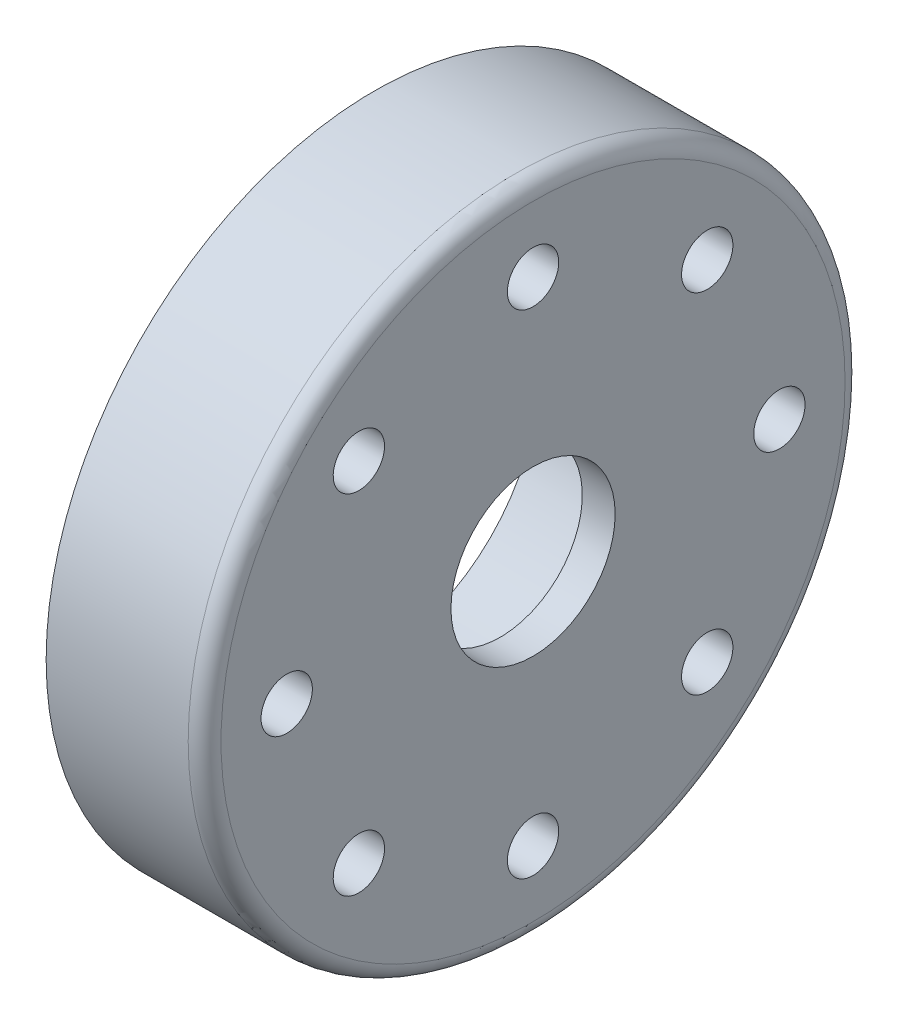
ISO-10303-21;
HEADER;
FILE_DESCRIPTION(('STEP AP214'),'2;1');
FILE_NAME('part.step','',(''),(''),'','','');
FILE_SCHEMA(('AUTOMOTIVE_DESIGN { 1 0 10303 214 1 1 1 1 }'));
ENDSEC;
DATA;
#1=APPLICATION_CONTEXT('core data for automotive mechanical design processes');
#2=APPLICATION_PROTOCOL_DEFINITION('international standard','automotive_design',2000,#1);
#3=PRODUCT_CONTEXT('',#1,'mechanical');
#4=PRODUCT('Part','Part','',(#3));
#5=PRODUCT_RELATED_PRODUCT_CATEGORY('part','',(#4));
#6=PRODUCT_DEFINITION_FORMATION('','',#4);
#7=PRODUCT_DEFINITION_CONTEXT('part definition',#1,'design');
#8=PRODUCT_DEFINITION('design','',#6,#7);
#9=PRODUCT_DEFINITION_SHAPE('','',#8);
#10=(LENGTH_UNIT() NAMED_UNIT(*) SI_UNIT(.MILLI.,.METRE.));
#11=(NAMED_UNIT(*) PLANE_ANGLE_UNIT() SI_UNIT($,.RADIAN.));
#12=(NAMED_UNIT(*) SI_UNIT($,.STERADIAN.) SOLID_ANGLE_UNIT());
#13=UNCERTAINTY_MEASURE_WITH_UNIT(LENGTH_MEASURE(1.E-05),#10,'distance_accuracy_value','');
#14=(GEOMETRIC_REPRESENTATION_CONTEXT(3) GLOBAL_UNCERTAINTY_ASSIGNED_CONTEXT((#13)) GLOBAL_UNIT_ASSIGNED_CONTEXT((#10,
#11,#12)) REPRESENTATION_CONTEXT('',''));
#15=CARTESIAN_POINT('',(0.,0.,0.));
#16=DIRECTION('',(0.,0.,1.));
#17=DIRECTION('',(1.,0.,0.));
#18=AXIS2_PLACEMENT_3D('',#15,#16,#17);
#19=CARTESIAN_POINT('',(24.511,0.,0.));
#20=DIRECTION('',(-1.,0.,0.));
#21=DIRECTION('',(0.,0.,1.));
#22=AXIS2_PLACEMENT_3D('',#19,#20,#21);
#23=CYLINDRICAL_SURFACE('',#22,50.8);
#24=CARTESIAN_POINT('',(21.971,0.,0.));
#25=DIRECTION('',(1.,0.,0.));
#26=DIRECTION('',(0.,0.,-1.));
#27=AXIS2_PLACEMENT_3D('',#24,#25,#26);
#28=CIRCLE('',#27,50.8);
#29=CARTESIAN_POINT('',(21.971,0.,-50.8));
#30=VERTEX_POINT('',#29);
#31=EDGE_CURVE('E11',#30,#30,#28,.F.);
#32=ORIENTED_EDGE('',*,*,#31,.T.);
#33=EDGE_LOOP('',(#32));
#34=FACE_BOUND('',#33,.T.);
#35=CARTESIAN_POINT('',(0.,0.,0.));
#36=DIRECTION('',(1.,0.,0.));
#37=DIRECTION('',(0.,0.,-1.));
#38=AXIS2_PLACEMENT_3D('',#35,#36,#37);
#39=CIRCLE('',#38,50.8);
#40=CARTESIAN_POINT('',(0.,0.,-50.8));
#41=VERTEX_POINT('',#40);
#42=EDGE_CURVE('E45',#41,#41,#39,.T.);
#43=ORIENTED_EDGE('',*,*,#42,.T.);
#44=EDGE_LOOP('',(#43));
#45=FACE_BOUND('',#44,.T.);
#46=ADVANCED_FACE('F34',(#34,#45),#23,.T.);
#47=CARTESIAN_POINT('',(24.511,0.,0.));
#48=DIRECTION('',(1.,0.,0.));
#49=DIRECTION('',(0.,0.,-1.));
#50=AXIS2_PLACEMENT_3D('',#47,#48,#49);
#51=PLANE('',#50);
#52=CARTESIAN_POINT('',(24.511,0.,0.));
#53=DIRECTION('',(1.,0.,0.));
#54=DIRECTION('',(0.,0.,-1.));
#55=AXIS2_PLACEMENT_3D('',#52,#53,#54);
#56=CIRCLE('',#55,12.7);
#57=CARTESIAN_POINT('',(24.511,0.,-12.7));
#58=VERTEX_POINT('',#57);
#59=EDGE_CURVE('E105',#58,#58,#56,.F.);
#60=ORIENTED_EDGE('',*,*,#59,.T.);
#61=EDGE_LOOP('',(#60));
#62=FACE_BOUND('',#61,.T.);
#63=CARTESIAN_POINT('',(24.511,-38.1,1.33025439009923E-13));
#64=DIRECTION('',(1.,0.,0.));
#65=DIRECTION('',(0.,-1.,0.));
#66=AXIS2_PLACEMENT_3D('',#63,#64,#65);
#67=CIRCLE('',#66,3.96875);
#68=CARTESIAN_POINT('',(24.511,-42.06875,1.46882255573457E-13));
#69=VERTEX_POINT('',#68);
#70=EDGE_CURVE('E63',#69,#69,#67,.T.);
#71=ORIENTED_EDGE('',*,*,#70,.F.);
#72=EDGE_LOOP('',(#71));
#73=FACE_BOUND('',#72,.T.);
#74=CARTESIAN_POINT('',(24.511,-26.9407683632073,26.9407683632076));
#75=DIRECTION('',(1.,0.,0.));
#76=DIRECTION('',(0.,-0.707106781186544,0.707106781186551));
#77=AXIS2_PLACEMENT_3D('',#74,#75,#76);
#78=CIRCLE('',#77,3.96875);
#79=CARTESIAN_POINT('',(24.511,-29.7470984010414,29.7470984010417));
#80=VERTEX_POINT('',#79);
#81=EDGE_CURVE('E78',#80,#80,#78,.T.);
#82=ORIENTED_EDGE('',*,*,#81,.F.);
#83=EDGE_LOOP('',(#82));
#84=FACE_BOUND('',#83,.T.);
#85=CARTESIAN_POINT('',(24.511,0.,38.1));
#86=DIRECTION('',(1.,0.,0.));
#87=DIRECTION('',(0.,0.,1.));
#88=AXIS2_PLACEMENT_3D('',#85,#86,#87);
#89=CIRCLE('',#88,3.96875);
#90=CARTESIAN_POINT('',(24.511,0.,42.06875));
#91=VERTEX_POINT('',#90);
#92=EDGE_CURVE('E72',#91,#91,#89,.T.);
#93=ORIENTED_EDGE('',*,*,#92,.F.);
#94=EDGE_LOOP('',(#93));
#95=FACE_BOUND('',#94,.T.);
#96=CARTESIAN_POINT('',(24.511,26.9407683632077,26.9407683632072));
#97=DIRECTION('',(1.,0.,0.));
#98=DIRECTION('',(0.,0.707106781186554,0.707106781186541));
#99=AXIS2_PLACEMENT_3D('',#96,#97,#98);
#100=CIRCLE('',#99,3.96875);
#101=CARTESIAN_POINT('',(24.511,29.7470984010418,29.7470984010413));
#102=VERTEX_POINT('',#101);
#103=EDGE_CURVE('E64',#102,#102,#100,.T.);
#104=ORIENTED_EDGE('',*,*,#103,.F.);
#105=EDGE_LOOP('',(#104));
#106=FACE_BOUND('',#105,.T.);
#107=CARTESIAN_POINT('',(24.511,38.1,-3.9907631702977E-13));
#108=DIRECTION('',(1.,0.,0.));
#109=DIRECTION('',(0.,1.,0.));
#110=AXIS2_PLACEMENT_3D('',#107,#108,#109);
#111=CIRCLE('',#110,3.96875);
#112=CARTESIAN_POINT('',(24.511,42.06875,-4.40646766720371E-13));
#113=VERTEX_POINT('',#112);
#114=EDGE_CURVE('E71',#113,#113,#111,.T.);
#115=ORIENTED_EDGE('',*,*,#114,.F.);
#116=EDGE_LOOP('',(#115));
#117=FACE_BOUND('',#116,.T.);
#118=CARTESIAN_POINT('',(24.511,26.9407683632071,-26.9407683632078));
#119=DIRECTION('',(1.,0.,0.));
#120=DIRECTION('',(0.,0.707106781186539,-0.707106781186556));
#121=AXIS2_PLACEMENT_3D('',#118,#119,#120);
#122=CIRCLE('',#121,3.96875);
#123=CARTESIAN_POINT('',(24.511,29.7470984010412,-29.7470984010419));
#124=VERTEX_POINT('',#123);
#125=EDGE_CURVE('E88',#124,#124,#122,.T.);
#126=ORIENTED_EDGE('',*,*,#125,.F.);
#127=EDGE_LOOP('',(#126));
#128=FACE_BOUND('',#127,.T.);
#129=CARTESIAN_POINT('',(24.511,-26.9407683632075,-26.9407683632074));
#130=DIRECTION('',(1.,0.,0.));
#131=DIRECTION('',(0.,-0.707106781186549,-0.707106781186546));
#132=AXIS2_PLACEMENT_3D('',#129,#130,#131);
#133=CIRCLE('',#132,3.96875);
#134=CARTESIAN_POINT('',(24.511,-29.7470984010416,-29.7470984010415));
#135=VERTEX_POINT('',#134);
#136=EDGE_CURVE('E57',#135,#135,#133,.T.);
#137=ORIENTED_EDGE('',*,*,#136,.F.);
#138=EDGE_LOOP('',(#137));
#139=FACE_BOUND('',#138,.T.);
#140=CARTESIAN_POINT('',(24.511,0.,-38.1));
#141=DIRECTION('',(1.,0.,0.));
#142=DIRECTION('',(0.,0.,-1.));
#143=AXIS2_PLACEMENT_3D('',#140,#141,#142);
#144=CIRCLE('',#143,3.96875);
#145=CARTESIAN_POINT('',(24.511,0.,-42.06875));
#146=VERTEX_POINT('',#145);
#147=EDGE_CURVE('E54',#146,#146,#144,.T.);
#148=ORIENTED_EDGE('',*,*,#147,.F.);
#149=EDGE_LOOP('',(#148));
#150=FACE_BOUND('',#149,.T.);
#151=CARTESIAN_POINT('',(24.511,0.,0.));
#152=DIRECTION('',(1.,0.,0.));
#153=DIRECTION('',(0.,0.,-1.));
#154=AXIS2_PLACEMENT_3D('',#151,#152,#153);
#155=CIRCLE('',#154,48.26);
#156=CARTESIAN_POINT('',(24.511,0.,-48.26));
#157=VERTEX_POINT('',#156);
#158=EDGE_CURVE('E41',#157,#157,#155,.T.);
#159=ORIENTED_EDGE('',*,*,#158,.T.);
#160=EDGE_LOOP('',(#159));
#161=FACE_BOUND('',#160,.T.);
#162=ADVANCED_FACE('F131',(#62,#73,#84,#95,#106,#117,#128,#139,#150,#161),#51,.T.);
#163=CARTESIAN_POINT('',(0.,0.,0.));
#164=DIRECTION('',(1.,0.,0.));
#165=DIRECTION('',(0.,0.,-1.));
#166=AXIS2_PLACEMENT_3D('',#163,#164,#165);
#167=PLANE('',#166);
#168=CARTESIAN_POINT('',(0.,0.,0.));
#169=DIRECTION('',(-1.,0.,0.));
#170=DIRECTION('',(0.,0.,1.));
#171=AXIS2_PLACEMENT_3D('',#168,#169,#170);
#172=CIRCLE('',#171,25.4);
#173=CARTESIAN_POINT('',(0.,0.,25.4));
#174=VERTEX_POINT('',#173);
#175=EDGE_CURVE('E102',#174,#174,#172,.T.);
#176=ORIENTED_EDGE('',*,*,#175,.F.);
#177=EDGE_LOOP('',(#176));
#178=FACE_BOUND('',#177,.T.);
#179=CARTESIAN_POINT('',(0.,-38.1,1.33025439009923E-13));
#180=DIRECTION('',(1.,0.,0.));
#181=DIRECTION('',(0.,-1.,0.));
#182=AXIS2_PLACEMENT_3D('',#179,#180,#181);
#183=CIRCLE('',#182,3.96875);
#184=CARTESIAN_POINT('',(0.,-42.06875,1.46882255573457E-13));
#185=VERTEX_POINT('',#184);
#186=EDGE_CURVE('E81',#185,#185,#183,.F.);
#187=ORIENTED_EDGE('',*,*,#186,.F.);
#188=EDGE_LOOP('',(#187));
#189=FACE_BOUND('',#188,.T.);
#190=CARTESIAN_POINT('',(0.,-26.9407683632073,26.9407683632076));
#191=DIRECTION('',(1.,0.,0.));
#192=DIRECTION('',(0.,-0.707106781186544,0.707106781186551));
#193=AXIS2_PLACEMENT_3D('',#190,#191,#192);
#194=CIRCLE('',#193,3.96875);
#195=CARTESIAN_POINT('',(0.,-29.7470984010414,29.7470984010417));
#196=VERTEX_POINT('',#195);
#197=EDGE_CURVE('E75',#196,#196,#194,.F.);
#198=ORIENTED_EDGE('',*,*,#197,.F.);
#199=EDGE_LOOP('',(#198));
#200=FACE_BOUND('',#199,.T.);
#201=CARTESIAN_POINT('',(0.,0.,38.1));
#202=DIRECTION('',(1.,0.,0.));
#203=DIRECTION('',(0.,0.,1.));
#204=AXIS2_PLACEMENT_3D('',#201,#202,#203);
#205=CIRCLE('',#204,3.96875);
#206=CARTESIAN_POINT('',(0.,0.,42.06875));
#207=VERTEX_POINT('',#206);
#208=EDGE_CURVE('E67',#207,#207,#205,.F.);
#209=ORIENTED_EDGE('',*,*,#208,.F.);
#210=EDGE_LOOP('',(#209));
#211=FACE_BOUND('',#210,.T.);
#212=CARTESIAN_POINT('',(0.,26.9407683632077,26.9407683632072));
#213=DIRECTION('',(1.,0.,0.));
#214=DIRECTION('',(0.,0.707106781186554,0.707106781186541));
#215=AXIS2_PLACEMENT_3D('',#212,#213,#214);
#216=CIRCLE('',#215,3.96875);
#217=CARTESIAN_POINT('',(0.,29.7470984010418,29.7470984010413));
#218=VERTEX_POINT('',#217);
#219=EDGE_CURVE('E68',#218,#218,#216,.F.);
#220=ORIENTED_EDGE('',*,*,#219,.F.);
#221=EDGE_LOOP('',(#220));
#222=FACE_BOUND('',#221,.T.);
#223=CARTESIAN_POINT('',(0.,38.1,-3.9907631702977E-13));
#224=DIRECTION('',(1.,0.,0.));
#225=DIRECTION('',(0.,1.,0.));
#226=AXIS2_PLACEMENT_3D('',#223,#224,#225);
#227=CIRCLE('',#226,3.96875);
#228=CARTESIAN_POINT('',(0.,42.06875,-4.40646766720371E-13));
#229=VERTEX_POINT('',#228);
#230=EDGE_CURVE('E91',#229,#229,#227,.F.);
#231=ORIENTED_EDGE('',*,*,#230,.F.);
#232=EDGE_LOOP('',(#231));
#233=FACE_BOUND('',#232,.T.);
#234=CARTESIAN_POINT('',(0.,26.9407683632071,-26.9407683632078));
#235=DIRECTION('',(1.,0.,0.));
#236=DIRECTION('',(0.,0.707106781186539,-0.707106781186556));
#237=AXIS2_PLACEMENT_3D('',#234,#235,#236);
#238=CIRCLE('',#237,3.96875);
#239=CARTESIAN_POINT('',(0.,29.7470984010412,-29.7470984010419));
#240=VERTEX_POINT('',#239);
#241=EDGE_CURVE('E92',#240,#240,#238,.F.);
#242=ORIENTED_EDGE('',*,*,#241,.F.);
#243=EDGE_LOOP('',(#242));
#244=FACE_BOUND('',#243,.T.);
#245=CARTESIAN_POINT('',(0.,-26.9407683632075,-26.9407683632074));
#246=DIRECTION('',(1.,0.,0.));
#247=DIRECTION('',(0.,-0.707106781186549,-0.707106781186546));
#248=AXIS2_PLACEMENT_3D('',#245,#246,#247);
#249=CIRCLE('',#248,3.96875);
#250=CARTESIAN_POINT('',(0.,-29.7470984010416,-29.7470984010415));
#251=VERTEX_POINT('',#250);
#252=EDGE_CURVE('E60',#251,#251,#249,.F.);
#253=ORIENTED_EDGE('',*,*,#252,.F.);
#254=EDGE_LOOP('',(#253));
#255=FACE_BOUND('',#254,.T.);
#256=CARTESIAN_POINT('',(0.,0.,-38.1));
#257=DIRECTION('',(1.,0.,0.));
#258=DIRECTION('',(0.,0.,-1.));
#259=AXIS2_PLACEMENT_3D('',#256,#257,#258);
#260=CIRCLE('',#259,3.96875);
#261=CARTESIAN_POINT('',(0.,0.,-42.06875));
#262=VERTEX_POINT('',#261);
#263=EDGE_CURVE('E49',#262,#262,#260,.F.);
#264=ORIENTED_EDGE('',*,*,#263,.F.);
#265=EDGE_LOOP('',(#264));
#266=FACE_BOUND('',#265,.T.);
#267=ORIENTED_EDGE('',*,*,#42,.F.);
#268=EDGE_LOOP('',(#267));
#269=FACE_BOUND('',#268,.T.);
#270=ADVANCED_FACE('F135',(#178,#189,#200,#211,#222,#233,#244,#255,#266,#269),#167,.F.);
#271=CARTESIAN_POINT('',(21.971,0.,0.));
#272=DIRECTION('',(1.,0.,0.));
#273=DIRECTION('',(0.,0.,-1.));
#274=AXIS2_PLACEMENT_3D('',#271,#272,#273);
#275=TOROIDAL_SURFACE('',#274,48.26,2.54);
#276=ORIENTED_EDGE('',*,*,#31,.F.);
#277=EDGE_LOOP('',(#276));
#278=FACE_BOUND('',#277,.T.);
#279=ORIENTED_EDGE('',*,*,#158,.F.);
#280=EDGE_LOOP('',(#279));
#281=FACE_BOUND('',#280,.T.);
#282=ADVANCED_FACE('F36',(#278,#281),#275,.T.);
#283=CARTESIAN_POINT('',(-11.2253201513364,0.,-38.1));
#284=DIRECTION('',(1.,0.,0.));
#285=DIRECTION('',(0.,0.,-1.));
#286=AXIS2_PLACEMENT_3D('',#283,#284,#285);
#287=CYLINDRICAL_SURFACE('',#286,3.96875);
#288=ORIENTED_EDGE('',*,*,#263,.T.);
#289=EDGE_LOOP('',(#288));
#290=FACE_BOUND('',#289,.T.);
#291=ORIENTED_EDGE('',*,*,#147,.T.);
#292=EDGE_LOOP('',(#291));
#293=FACE_BOUND('',#292,.T.);
#294=ADVANCED_FACE('F143',(#290,#293),#287,.F.);
#295=CARTESIAN_POINT('',(-11.2253201513364,-26.9407683632075,-26.9407683632074));
#296=DIRECTION('',(1.,0.,0.));
#297=DIRECTION('',(0.,-0.707106781186549,-0.707106781186546));
#298=AXIS2_PLACEMENT_3D('',#295,#296,#297);
#299=CYLINDRICAL_SURFACE('',#298,3.96875);
#300=ORIENTED_EDGE('',*,*,#252,.T.);
#301=EDGE_LOOP('',(#300));
#302=FACE_BOUND('',#301,.T.);
#303=ORIENTED_EDGE('',*,*,#136,.T.);
#304=EDGE_LOOP('',(#303));
#305=FACE_BOUND('',#304,.T.);
#306=ADVANCED_FACE('F146',(#302,#305),#299,.F.);
#307=CARTESIAN_POINT('',(-11.2253201513364,26.9407683632071,-26.9407683632078));
#308=DIRECTION('',(1.,0.,0.));
#309=DIRECTION('',(0.,0.707106781186539,-0.707106781186556));
#310=AXIS2_PLACEMENT_3D('',#307,#308,#309);
#311=CYLINDRICAL_SURFACE('',#310,3.96875);
#312=ORIENTED_EDGE('',*,*,#241,.T.);
#313=EDGE_LOOP('',(#312));
#314=FACE_BOUND('',#313,.T.);
#315=ORIENTED_EDGE('',*,*,#125,.T.);
#316=EDGE_LOOP('',(#315));
#317=FACE_BOUND('',#316,.T.);
#318=ADVANCED_FACE('F150',(#314,#317),#311,.F.);
#319=CARTESIAN_POINT('',(-11.2253201513364,38.1,-3.9907631702977E-13));
#320=DIRECTION('',(1.,0.,0.));
#321=DIRECTION('',(0.,1.,0.));
#322=AXIS2_PLACEMENT_3D('',#319,#320,#321);
#323=CYLINDRICAL_SURFACE('',#322,3.96875);
#324=ORIENTED_EDGE('',*,*,#230,.T.);
#325=EDGE_LOOP('',(#324));
#326=FACE_BOUND('',#325,.T.);
#327=ORIENTED_EDGE('',*,*,#114,.T.);
#328=EDGE_LOOP('',(#327));
#329=FACE_BOUND('',#328,.T.);
#330=ADVANCED_FACE('F156',(#326,#329),#323,.F.);
#331=CARTESIAN_POINT('',(-11.2253201513364,26.9407683632077,26.9407683632072));
#332=DIRECTION('',(1.,0.,0.));
#333=DIRECTION('',(0.,0.707106781186554,0.707106781186541));
#334=AXIS2_PLACEMENT_3D('',#331,#332,#333);
#335=CYLINDRICAL_SURFACE('',#334,3.96875);
#336=ORIENTED_EDGE('',*,*,#219,.T.);
#337=EDGE_LOOP('',(#336));
#338=FACE_BOUND('',#337,.T.);
#339=ORIENTED_EDGE('',*,*,#103,.T.);
#340=EDGE_LOOP('',(#339));
#341=FACE_BOUND('',#340,.T.);
#342=ADVANCED_FACE('F152',(#338,#341),#335,.F.);
#343=CARTESIAN_POINT('',(-11.2253201513364,0.,38.1));
#344=DIRECTION('',(1.,0.,0.));
#345=DIRECTION('',(0.,0.,1.));
#346=AXIS2_PLACEMENT_3D('',#343,#344,#345);
#347=CYLINDRICAL_SURFACE('',#346,3.96875);
#348=ORIENTED_EDGE('',*,*,#208,.T.);
#349=EDGE_LOOP('',(#348));
#350=FACE_BOUND('',#349,.T.);
#351=ORIENTED_EDGE('',*,*,#92,.T.);
#352=EDGE_LOOP('',(#351));
#353=FACE_BOUND('',#352,.T.);
#354=ADVANCED_FACE('F155',(#350,#353),#347,.F.);
#355=CARTESIAN_POINT('',(-11.2253201513364,-26.9407683632073,26.9407683632076));
#356=DIRECTION('',(1.,0.,0.));
#357=DIRECTION('',(0.,-0.707106781186544,0.707106781186551));
#358=AXIS2_PLACEMENT_3D('',#355,#356,#357);
#359=CYLINDRICAL_SURFACE('',#358,3.96875);
#360=ORIENTED_EDGE('',*,*,#197,.T.);
#361=EDGE_LOOP('',(#360));
#362=FACE_BOUND('',#361,.T.);
#363=ORIENTED_EDGE('',*,*,#81,.T.);
#364=EDGE_LOOP('',(#363));
#365=FACE_BOUND('',#364,.T.);
#366=ADVANCED_FACE('F160',(#362,#365),#359,.F.);
#367=CARTESIAN_POINT('',(-11.2253201513364,-38.1,1.33025439009923E-13));
#368=DIRECTION('',(1.,0.,0.));
#369=DIRECTION('',(0.,-1.,0.));
#370=AXIS2_PLACEMENT_3D('',#367,#368,#369);
#371=CYLINDRICAL_SURFACE('',#370,3.96875);
#372=ORIENTED_EDGE('',*,*,#186,.T.);
#373=EDGE_LOOP('',(#372));
#374=FACE_BOUND('',#373,.T.);
#375=ORIENTED_EDGE('',*,*,#70,.T.);
#376=EDGE_LOOP('',(#375));
#377=FACE_BOUND('',#376,.T.);
#378=ADVANCED_FACE('F119',(#374,#377),#371,.F.);
#379=CARTESIAN_POINT('',(19.431,0.,0.));
#380=DIRECTION('',(1.,0.,0.));
#381=DIRECTION('',(0.,0.,-1.));
#382=AXIS2_PLACEMENT_3D('',#379,#380,#381);
#383=PLANE('',#382);
#384=CARTESIAN_POINT('',(19.431,0.,0.));
#385=DIRECTION('',(-1.,0.,0.));
#386=DIRECTION('',(0.,0.,1.));
#387=AXIS2_PLACEMENT_3D('',#384,#385,#386);
#388=CIRCLE('',#387,12.7);
#389=CARTESIAN_POINT('',(19.431,0.,12.7));
#390=VERTEX_POINT('',#389);
#391=EDGE_CURVE('E108',#390,#390,#388,.T.);
#392=ORIENTED_EDGE('',*,*,#391,.F.);
#393=EDGE_LOOP('',(#392));
#394=FACE_BOUND('',#393,.T.);
#395=CARTESIAN_POINT('',(19.431,0.,0.));
#396=DIRECTION('',(1.,0.,0.));
#397=DIRECTION('',(0.,0.,-1.));
#398=AXIS2_PLACEMENT_3D('',#395,#396,#397);
#399=CIRCLE('',#398,25.4);
#400=CARTESIAN_POINT('',(19.431,0.,-25.4));
#401=VERTEX_POINT('',#400);
#402=EDGE_CURVE('E95',#401,#401,#399,.F.);
#403=ORIENTED_EDGE('',*,*,#402,.T.);
#404=EDGE_LOOP('',(#403));
#405=FACE_BOUND('',#404,.T.);
#406=ADVANCED_FACE('F115',(#394,#405),#383,.F.);
#407=CARTESIAN_POINT('',(96.3530489685532,0.,0.));
#408=DIRECTION('',(-1.,0.,0.));
#409=DIRECTION('',(0.,0.,1.));
#410=AXIS2_PLACEMENT_3D('',#407,#408,#409);
#411=CYLINDRICAL_SURFACE('',#410,25.4);
#412=ORIENTED_EDGE('',*,*,#175,.T.);
#413=EDGE_LOOP('',(#412));
#414=FACE_BOUND('',#413,.T.);
#415=ORIENTED_EDGE('',*,*,#402,.F.);
#416=EDGE_LOOP('',(#415));
#417=FACE_BOUND('',#416,.T.);
#418=ADVANCED_FACE('F118',(#414,#417),#411,.F.);
#419=CARTESIAN_POINT('',(60.4320244842766,0.,0.));
#420=DIRECTION('',(-1.,0.,0.));
#421=DIRECTION('',(0.,0.,1.));
#422=AXIS2_PLACEMENT_3D('',#419,#420,#421);
#423=CYLINDRICAL_SURFACE('',#422,12.7);
#424=ORIENTED_EDGE('',*,*,#391,.T.);
#425=EDGE_LOOP('',(#424));
#426=FACE_BOUND('',#425,.T.);
#427=ORIENTED_EDGE('',*,*,#59,.F.);
#428=EDGE_LOOP('',(#427));
#429=FACE_BOUND('',#428,.T.);
#430=ADVANCED_FACE('F112',(#426,#429),#423,.F.);
#431=CLOSED_SHELL('',(#46,#162,#270,#282,#294,#306,#318,#330,#342,#354,#366,#378,#406,#418,#430));
#432=MANIFOLD_SOLID_BREP('B2',#431);
#433=ADVANCED_BREP_SHAPE_REPRESENTATION('',(#18,#432),#14);
#434=SHAPE_DEFINITION_REPRESENTATION(#9,#433);
ENDSEC;
END-ISO-10303-21;
